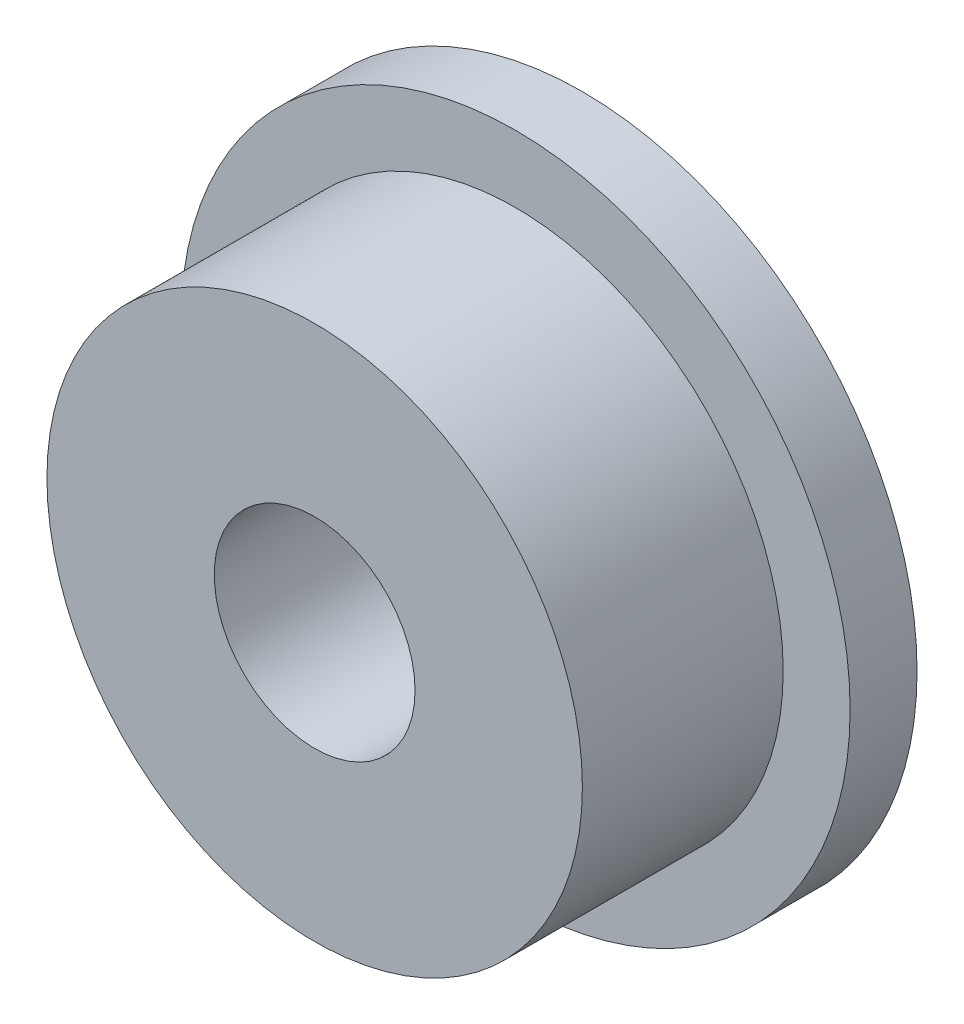
ISO-10303-21;
HEADER;
FILE_DESCRIPTION(('STEP AP214'),'2;1');
FILE_NAME('part.step','',(''),(''),'','','');
FILE_SCHEMA(('AUTOMOTIVE_DESIGN { 1 0 10303 214 1 1 1 1 }'));
ENDSEC;
DATA;
#1=APPLICATION_CONTEXT('core data for automotive mechanical design processes');
#2=APPLICATION_PROTOCOL_DEFINITION('international standard','automotive_design',2000,#1);
#3=PRODUCT_CONTEXT('',#1,'mechanical');
#4=PRODUCT('Part','Part','',(#3));
#5=PRODUCT_RELATED_PRODUCT_CATEGORY('part','',(#4));
#6=PRODUCT_DEFINITION_FORMATION('','',#4);
#7=PRODUCT_DEFINITION_CONTEXT('part definition',#1,'design');
#8=PRODUCT_DEFINITION('design','',#6,#7);
#9=PRODUCT_DEFINITION_SHAPE('','',#8);
#10=(LENGTH_UNIT() NAMED_UNIT(*) SI_UNIT(.MILLI.,.METRE.));
#11=(NAMED_UNIT(*) PLANE_ANGLE_UNIT() SI_UNIT($,.RADIAN.));
#12=(NAMED_UNIT(*) SI_UNIT($,.STERADIAN.) SOLID_ANGLE_UNIT());
#13=UNCERTAINTY_MEASURE_WITH_UNIT(LENGTH_MEASURE(1.E-05),#10,'distance_accuracy_value','');
#14=(GEOMETRIC_REPRESENTATION_CONTEXT(3) GLOBAL_UNCERTAINTY_ASSIGNED_CONTEXT((#13)) GLOBAL_UNIT_ASSIGNED_CONTEXT((#10,
#11,#12)) REPRESENTATION_CONTEXT('',''));
#15=CARTESIAN_POINT('',(0.,0.,0.));
#16=DIRECTION('',(0.,0.,1.));
#17=DIRECTION('',(1.,0.,0.));
#18=AXIS2_PLACEMENT_3D('',#15,#16,#17);
#19=CARTESIAN_POINT('',(0.,0.,4.));
#20=DIRECTION('',(0.,0.,1.));
#21=DIRECTION('',(1.,0.,0.));
#22=AXIS2_PLACEMENT_3D('',#19,#20,#21);
#23=PLANE('',#22);
#24=CARTESIAN_POINT('',(0.,0.,4.));
#25=DIRECTION('',(0.,0.,1.));
#26=DIRECTION('',(1.,0.,0.));
#27=AXIS2_PLACEMENT_3D('',#24,#25,#26);
#28=CIRCLE('',#27,4.);
#29=CARTESIAN_POINT('',(4.,0.,4.));
#30=VERTEX_POINT('',#29);
#31=EDGE_CURVE('E11',#30,#30,#28,.T.);
#32=ORIENTED_EDGE('',*,*,#31,.T.);
#33=EDGE_LOOP('',(#32));
#34=FACE_BOUND('',#33,.T.);
#35=CARTESIAN_POINT('',(0.,0.,4.));
#36=DIRECTION('',(0.,0.,1.));
#37=DIRECTION('',(1.,0.,0.));
#38=AXIS2_PLACEMENT_3D('',#35,#36,#37);
#39=CIRCLE('',#38,1.5);
#40=CARTESIAN_POINT('',(1.5,0.,4.));
#41=VERTEX_POINT('',#40);
#42=EDGE_CURVE('E51',#41,#41,#39,.T.);
#43=ORIENTED_EDGE('',*,*,#42,.F.);
#44=EDGE_LOOP('',(#43));
#45=FACE_BOUND('',#44,.T.);
#46=ADVANCED_FACE('F44',(#34,#45),#23,.T.);
#47=CARTESIAN_POINT('',(0.,0.,0.));
#48=DIRECTION('',(0.,0.,1.));
#49=DIRECTION('',(1.,0.,0.));
#50=AXIS2_PLACEMENT_3D('',#47,#48,#49);
#51=PLANE('',#50);
#52=CARTESIAN_POINT('',(0.,0.,0.));
#53=DIRECTION('',(0.,0.,1.));
#54=DIRECTION('',(1.,0.,0.));
#55=AXIS2_PLACEMENT_3D('',#52,#53,#54);
#56=CIRCLE('',#55,1.5);
#57=CARTESIAN_POINT('',(1.5,0.,0.));
#58=VERTEX_POINT('',#57);
#59=EDGE_CURVE('E55',#58,#58,#56,.T.);
#60=ORIENTED_EDGE('',*,*,#59,.T.);
#61=EDGE_LOOP('',(#60));
#62=FACE_BOUND('',#61,.T.);
#63=CARTESIAN_POINT('',(0.,0.,0.));
#64=DIRECTION('',(0.,0.,1.));
#65=DIRECTION('',(1.,0.,0.));
#66=AXIS2_PLACEMENT_3D('',#63,#64,#65);
#67=CIRCLE('',#66,5.);
#68=CARTESIAN_POINT('',(5.,0.,0.));
#69=VERTEX_POINT('',#68);
#70=EDGE_CURVE('E65',#69,#69,#67,.T.);
#71=ORIENTED_EDGE('',*,*,#70,.F.);
#72=EDGE_LOOP('',(#71));
#73=FACE_BOUND('',#72,.T.);
#74=ADVANCED_FACE('F80',(#62,#73),#51,.F.);
#75=CARTESIAN_POINT('',(0.,0.,4.));
#76=DIRECTION('',(0.,0.,-1.));
#77=DIRECTION('',(-1.,0.,0.));
#78=AXIS2_PLACEMENT_3D('',#75,#76,#77);
#79=CYLINDRICAL_SURFACE('',#78,4.);
#80=CARTESIAN_POINT('',(0.,0.,1.));
#81=DIRECTION('',(0.,0.,1.));
#82=DIRECTION('',(1.,0.,0.));
#83=AXIS2_PLACEMENT_3D('',#80,#81,#82);
#84=CIRCLE('',#83,4.);
#85=CARTESIAN_POINT('',(4.,0.,1.));
#86=VERTEX_POINT('',#85);
#87=EDGE_CURVE('E60',#86,#86,#84,.T.);
#88=ORIENTED_EDGE('',*,*,#87,.T.);
#89=EDGE_LOOP('',(#88));
#90=FACE_BOUND('',#89,.T.);
#91=ORIENTED_EDGE('',*,*,#31,.F.);
#92=EDGE_LOOP('',(#91));
#93=FACE_BOUND('',#92,.T.);
#94=ADVANCED_FACE('F46',(#90,#93),#79,.T.);
#95=CARTESIAN_POINT('',(0.,0.,4.));
#96=DIRECTION('',(0.,0.,-1.));
#97=DIRECTION('',(-1.,0.,0.));
#98=AXIS2_PLACEMENT_3D('',#95,#96,#97);
#99=CYLINDRICAL_SURFACE('',#98,1.5);
#100=ORIENTED_EDGE('',*,*,#42,.T.);
#101=EDGE_LOOP('',(#100));
#102=FACE_BOUND('',#101,.T.);
#103=ORIENTED_EDGE('',*,*,#59,.F.);
#104=EDGE_LOOP('',(#103));
#105=FACE_BOUND('',#104,.T.);
#106=ADVANCED_FACE('F87',(#102,#105),#99,.F.);
#107=CARTESIAN_POINT('',(0.,0.,1.));
#108=DIRECTION('',(0.,0.,1.));
#109=DIRECTION('',(1.,0.,0.));
#110=AXIS2_PLACEMENT_3D('',#107,#108,#109);
#111=PLANE('',#110);
#112=CARTESIAN_POINT('',(0.,0.,1.));
#113=DIRECTION('',(0.,0.,1.));
#114=DIRECTION('',(1.,0.,0.));
#115=AXIS2_PLACEMENT_3D('',#112,#113,#114);
#116=CIRCLE('',#115,5.);
#117=CARTESIAN_POINT('',(5.,0.,1.));
#118=VERTEX_POINT('',#117);
#119=EDGE_CURVE('E64',#118,#118,#116,.T.);
#120=ORIENTED_EDGE('',*,*,#119,.T.);
#121=EDGE_LOOP('',(#120));
#122=FACE_BOUND('',#121,.T.);
#123=ORIENTED_EDGE('',*,*,#87,.F.);
#124=EDGE_LOOP('',(#123));
#125=FACE_BOUND('',#124,.T.);
#126=ADVANCED_FACE('F71',(#122,#125),#111,.T.);
#127=CARTESIAN_POINT('',(0.,0.,1.));
#128=DIRECTION('',(0.,0.,-1.));
#129=DIRECTION('',(-1.,0.,0.));
#130=AXIS2_PLACEMENT_3D('',#127,#128,#129);
#131=CYLINDRICAL_SURFACE('',#130,5.);
#132=ORIENTED_EDGE('',*,*,#119,.F.);
#133=EDGE_LOOP('',(#132));
#134=FACE_BOUND('',#133,.T.);
#135=ORIENTED_EDGE('',*,*,#70,.T.);
#136=EDGE_LOOP('',(#135));
#137=FACE_BOUND('',#136,.T.);
#138=ADVANCED_FACE('F74',(#134,#137),#131,.T.);
#139=CLOSED_SHELL('',(#46,#74,#94,#106,#126,#138));
#140=MANIFOLD_SOLID_BREP('B2',#139);
#141=ADVANCED_BREP_SHAPE_REPRESENTATION('',(#18,#140),#14);
#142=SHAPE_DEFINITION_REPRESENTATION(#9,#141);
ENDSEC;
END-ISO-10303-21;
